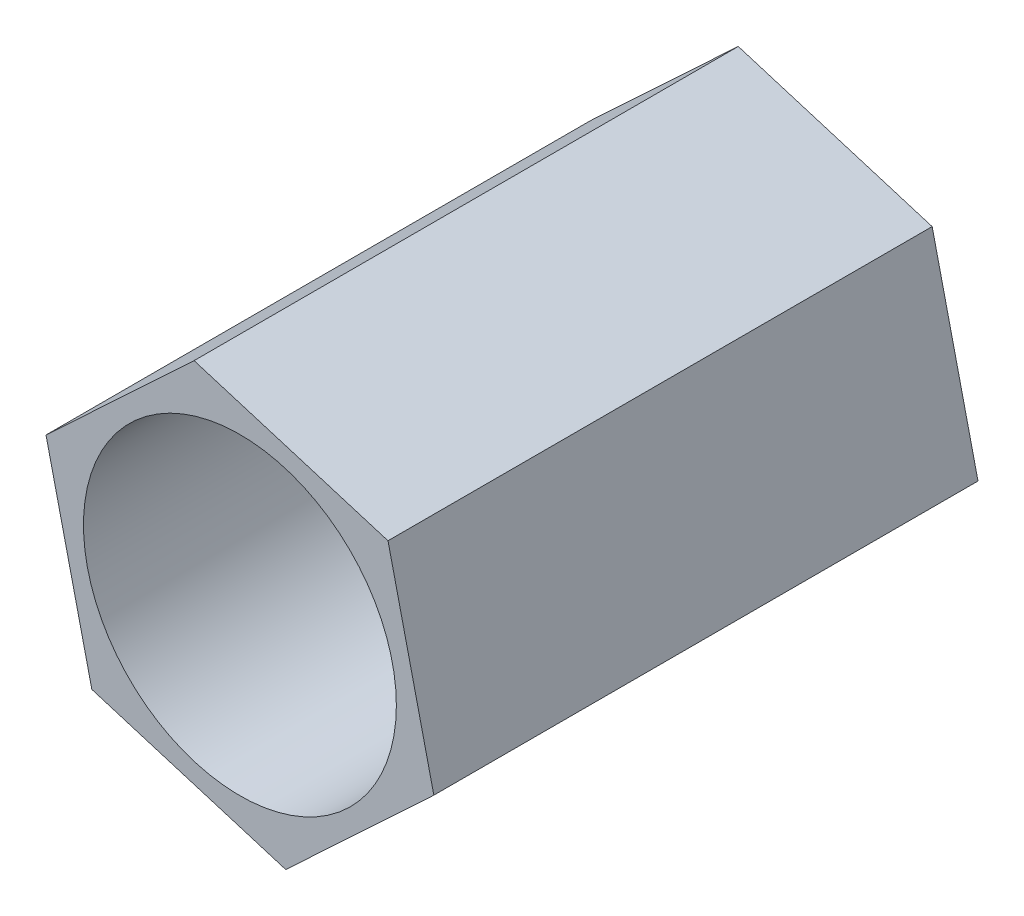
ISO-10303-21;
HEADER;
FILE_DESCRIPTION(('STEP AP214'),'2;1');
FILE_NAME('part.step','',(''),(''),'','','');
FILE_SCHEMA(('AUTOMOTIVE_DESIGN { 1 0 10303 214 1 1 1 1 }'));
ENDSEC;
DATA;
#1=APPLICATION_CONTEXT('core data for automotive mechanical design processes');
#2=APPLICATION_PROTOCOL_DEFINITION('international standard','automotive_design',2000,#1);
#3=PRODUCT_CONTEXT('',#1,'mechanical');
#4=PRODUCT('Part','Part','',(#3));
#5=PRODUCT_RELATED_PRODUCT_CATEGORY('part','',(#4));
#6=PRODUCT_DEFINITION_FORMATION('','',#4);
#7=PRODUCT_DEFINITION_CONTEXT('part definition',#1,'design');
#8=PRODUCT_DEFINITION('design','',#6,#7);
#9=PRODUCT_DEFINITION_SHAPE('','',#8);
#10=(LENGTH_UNIT() NAMED_UNIT(*) SI_UNIT(.MILLI.,.METRE.));
#11=(NAMED_UNIT(*) PLANE_ANGLE_UNIT() SI_UNIT($,.RADIAN.));
#12=(NAMED_UNIT(*) SI_UNIT($,.STERADIAN.) SOLID_ANGLE_UNIT());
#13=UNCERTAINTY_MEASURE_WITH_UNIT(LENGTH_MEASURE(1.E-05),#10,'distance_accuracy_value','');
#14=(GEOMETRIC_REPRESENTATION_CONTEXT(3) GLOBAL_UNCERTAINTY_ASSIGNED_CONTEXT((#13)) GLOBAL_UNIT_ASSIGNED_CONTEXT((#10,
#11,#12)) REPRESENTATION_CONTEXT('',''));
#15=CARTESIAN_POINT('',(0.,0.,0.));
#16=DIRECTION('',(0.,0.,1.));
#17=DIRECTION('',(1.,0.,0.));
#18=AXIS2_PLACEMENT_3D('',#15,#16,#17);
#19=CARTESIAN_POINT('',(0.,0.,10.));
#20=DIRECTION('',(0.,0.,1.));
#21=DIRECTION('',(1.,0.,0.));
#22=AXIS2_PLACEMENT_3D('',#19,#20,#21);
#23=PLANE('',#22);
#24=DIRECTION('',(0.226137706659468,-0.974095343191207,0.));
#25=VECTOR('',#24,1.);
#26=CARTESIAN_POINT('',(-3.56355911924937,1.08474485645919,10.));
#27=LINE('',#26,#25);
#28=CARTESIAN_POINT('',(-3.56355911924937,1.08474485645919,10.));
#29=VERTEX_POINT('',#28);
#30=CARTESIAN_POINT('',(-2.72119616194285,-2.54376029692806,10.));
#31=VERTEX_POINT('',#30);
#32=EDGE_CURVE('E146',#29,#31,#27,.T.);
#33=ORIENTED_EDGE('',*,*,#32,.T.);
#34=DIRECTION('',(0.956660166241441,-0.291206672874951,0.));
#35=VECTOR('',#34,1.);
#36=CARTESIAN_POINT('',(-2.72119616194285,-2.54376029692806,10.));
#37=LINE('',#36,#35);
#38=CARTESIAN_POINT('',(0.842362957306519,-3.62850515338725,10.));
#39=VERTEX_POINT('',#38);
#40=EDGE_CURVE('E94',#31,#39,#37,.T.);
#41=ORIENTED_EDGE('',*,*,#40,.T.);
#42=DIRECTION('',(0.730522459581972,0.682888670316257,0.));
#43=VECTOR('',#42,1.);
#44=CARTESIAN_POINT('',(0.842362957306519,-3.62850515338725,10.));
#45=LINE('',#44,#43);
#46=CARTESIAN_POINT('',(3.56355911924937,-1.08474485645919,10.));
#47=VERTEX_POINT('',#46);
#48=EDGE_CURVE('E107',#39,#47,#45,.T.);
#49=ORIENTED_EDGE('',*,*,#48,.T.);
#50=DIRECTION('',(-0.226137706659469,0.974095343191208,0.));
#51=VECTOR('',#50,1.);
#52=CARTESIAN_POINT('',(3.56355911924937,-1.08474485645919,10.));
#53=LINE('',#52,#51);
#54=CARTESIAN_POINT('',(2.72119616194285,2.54376029692806,10.));
#55=VERTEX_POINT('',#54);
#56=EDGE_CURVE('E101',#47,#55,#53,.T.);
#57=ORIENTED_EDGE('',*,*,#56,.T.);
#58=DIRECTION('',(-0.956660166241441,0.291206672874951,0.));
#59=VECTOR('',#58,1.);
#60=CARTESIAN_POINT('',(2.72119616194285,2.54376029692806,10.));
#61=LINE('',#60,#59);
#62=CARTESIAN_POINT('',(-0.84236295730652,3.62850515338725,10.));
#63=VERTEX_POINT('',#62);
#64=EDGE_CURVE('E105',#55,#63,#61,.T.);
#65=ORIENTED_EDGE('',*,*,#64,.T.);
#66=DIRECTION('',(-0.730522459581972,-0.682888670316257,0.));
#67=VECTOR('',#66,1.);
#68=CARTESIAN_POINT('',(-0.84236295730652,3.62850515338725,10.));
#69=LINE('',#68,#67);
#70=EDGE_CURVE('E57',#63,#29,#69,.T.);
#71=ORIENTED_EDGE('',*,*,#70,.T.);
#72=EDGE_LOOP('',(#33,#41,#49,#57,#65,#71));
#73=FACE_BOUND('',#72,.T.);
#74=CARTESIAN_POINT('',(0.,0.,10.));
#75=DIRECTION('',(0.,0.,1.));
#76=DIRECTION('',(1.,0.,0.));
#77=AXIS2_PLACEMENT_3D('',#74,#75,#76);
#78=CIRCLE('',#77,2.875);
#79=CARTESIAN_POINT('',(2.875,0.,10.));
#80=VERTEX_POINT('',#79);
#81=EDGE_CURVE('E134',#80,#80,#78,.T.);
#82=ORIENTED_EDGE('',*,*,#81,.F.);
#83=EDGE_LOOP('',(#82));
#84=FACE_BOUND('',#83,.T.);
#85=ADVANCED_FACE('F39',(#73,#84),#23,.T.);
#86=CARTESIAN_POINT('',(0.,0.,0.));
#87=DIRECTION('',(0.,0.,1.));
#88=DIRECTION('',(1.,0.,0.));
#89=AXIS2_PLACEMENT_3D('',#86,#87,#88);
#90=PLANE('',#89);
#91=DIRECTION('',(0.226137706659468,-0.974095343191207,0.));
#92=VECTOR('',#91,1.);
#93=CARTESIAN_POINT('',(-3.56355911924937,1.08474485645919,0.));
#94=LINE('',#93,#92);
#95=CARTESIAN_POINT('',(-3.56355911924937,1.08474485645919,0.));
#96=VERTEX_POINT('',#95);
#97=CARTESIAN_POINT('',(-2.72119616194285,-2.54376029692806,0.));
#98=VERTEX_POINT('',#97);
#99=EDGE_CURVE('E129',#96,#98,#94,.T.);
#100=ORIENTED_EDGE('',*,*,#99,.F.);
#101=DIRECTION('',(-0.730522459581972,-0.682888670316257,0.));
#102=VECTOR('',#101,1.);
#103=CARTESIAN_POINT('',(-0.84236295730652,3.62850515338725,0.));
#104=LINE('',#103,#102);
#105=CARTESIAN_POINT('',(-0.84236295730652,3.62850515338725,0.));
#106=VERTEX_POINT('',#105);
#107=EDGE_CURVE('E86',#106,#96,#104,.T.);
#108=ORIENTED_EDGE('',*,*,#107,.F.);
#109=DIRECTION('',(-0.956660166241441,0.291206672874951,0.));
#110=VECTOR('',#109,1.);
#111=CARTESIAN_POINT('',(2.72119616194285,2.54376029692806,0.));
#112=LINE('',#111,#110);
#113=CARTESIAN_POINT('',(2.72119616194285,2.54376029692806,0.));
#114=VERTEX_POINT('',#113);
#115=EDGE_CURVE('E80',#114,#106,#112,.T.);
#116=ORIENTED_EDGE('',*,*,#115,.F.);
#117=DIRECTION('',(-0.226137706659469,0.974095343191208,0.));
#118=VECTOR('',#117,1.);
#119=CARTESIAN_POINT('',(3.56355911924937,-1.08474485645919,0.));
#120=LINE('',#119,#118);
#121=CARTESIAN_POINT('',(3.56355911924937,-1.08474485645919,0.));
#122=VERTEX_POINT('',#121);
#123=EDGE_CURVE('E116',#122,#114,#120,.T.);
#124=ORIENTED_EDGE('',*,*,#123,.F.);
#125=DIRECTION('',(0.730522459581972,0.682888670316257,0.));
#126=VECTOR('',#125,1.);
#127=CARTESIAN_POINT('',(0.842362957306519,-3.62850515338725,0.));
#128=LINE('',#127,#126);
#129=CARTESIAN_POINT('',(0.842362957306519,-3.62850515338725,0.));
#130=VERTEX_POINT('',#129);
#131=EDGE_CURVE('E137',#130,#122,#128,.T.);
#132=ORIENTED_EDGE('',*,*,#131,.F.);
#133=DIRECTION('',(0.956660166241441,-0.291206672874951,0.));
#134=VECTOR('',#133,1.);
#135=CARTESIAN_POINT('',(-2.72119616194285,-2.54376029692806,0.));
#136=LINE('',#135,#134);
#137=EDGE_CURVE('E133',#98,#130,#136,.T.);
#138=ORIENTED_EDGE('',*,*,#137,.F.);
#139=EDGE_LOOP('',(#100,#108,#116,#124,#132,#138));
#140=FACE_BOUND('',#139,.T.);
#141=CARTESIAN_POINT('',(0.,0.,0.));
#142=DIRECTION('',(0.,0.,1.));
#143=DIRECTION('',(1.,0.,0.));
#144=AXIS2_PLACEMENT_3D('',#141,#142,#143);
#145=CIRCLE('',#144,2.875);
#146=CARTESIAN_POINT('',(2.875,0.,0.));
#147=VERTEX_POINT('',#146);
#148=EDGE_CURVE('E243',#147,#147,#145,.T.);
#149=ORIENTED_EDGE('',*,*,#148,.T.);
#150=EDGE_LOOP('',(#149));
#151=FACE_BOUND('',#150,.T.);
#152=ADVANCED_FACE('F159',(#140,#151),#90,.F.);
#153=CARTESIAN_POINT('',(-3.56355911924937,1.08474485645919,10.));
#154=DIRECTION('',(0.974095343191208,0.226137706659468,0.));
#155=DIRECTION('',(-0.226137706659468,0.974095343191208,0.));
#156=AXIS2_PLACEMENT_3D('',#153,#154,#155);
#157=PLANE('',#156);
#158=ORIENTED_EDGE('',*,*,#99,.T.);
#159=DIRECTION('',(0.,0.,-1.));
#160=VECTOR('',#159,1.);
#161=CARTESIAN_POINT('',(-2.72119616194285,-2.54376029692806,10.));
#162=LINE('',#161,#160);
#163=EDGE_CURVE('E11',#31,#98,#162,.T.);
#164=ORIENTED_EDGE('',*,*,#163,.F.);
#165=ORIENTED_EDGE('',*,*,#32,.F.);
#166=DIRECTION('',(0.,0.,-1.));
#167=VECTOR('',#166,1.);
#168=CARTESIAN_POINT('',(-3.56355911924937,1.08474485645919,10.));
#169=LINE('',#168,#167);
#170=EDGE_CURVE('E125',#29,#96,#169,.T.);
#171=ORIENTED_EDGE('',*,*,#170,.T.);
#172=EDGE_LOOP('',(#158,#164,#165,#171));
#173=FACE_BOUND('',#172,.T.);
#174=ADVANCED_FACE('F41',(#173),#157,.F.);
#175=CARTESIAN_POINT('',(-2.72119616194285,-2.54376029692806,10.));
#176=DIRECTION('',(0.291206672874951,0.956660166241441,0.));
#177=DIRECTION('',(-0.956660166241441,0.291206672874951,0.));
#178=AXIS2_PLACEMENT_3D('',#175,#176,#177);
#179=PLANE('',#178);
#180=ORIENTED_EDGE('',*,*,#137,.T.);
#181=DIRECTION('',(0.,0.,-1.));
#182=VECTOR('',#181,1.);
#183=CARTESIAN_POINT('',(0.842362957306519,-3.62850515338725,10.));
#184=LINE('',#183,#182);
#185=EDGE_CURVE('E49',#39,#130,#184,.T.);
#186=ORIENTED_EDGE('',*,*,#185,.F.);
#187=ORIENTED_EDGE('',*,*,#40,.F.);
#188=ORIENTED_EDGE('',*,*,#163,.T.);
#189=EDGE_LOOP('',(#180,#186,#187,#188));
#190=FACE_BOUND('',#189,.T.);
#191=ADVANCED_FACE('F184',(#190),#179,.F.);
#192=CARTESIAN_POINT('',(0.842362957306519,-3.62850515338725,10.));
#193=DIRECTION('',(-0.682888670316257,0.730522459581972,0.));
#194=DIRECTION('',(-0.730522459581972,-0.682888670316257,0.));
#195=AXIS2_PLACEMENT_3D('',#192,#193,#194);
#196=PLANE('',#195);
#197=ORIENTED_EDGE('',*,*,#131,.T.);
#198=DIRECTION('',(0.,0.,-1.));
#199=VECTOR('',#198,1.);
#200=CARTESIAN_POINT('',(3.56355911924937,-1.08474485645919,10.));
#201=LINE('',#200,#199);
#202=EDGE_CURVE('E118',#47,#122,#201,.T.);
#203=ORIENTED_EDGE('',*,*,#202,.F.);
#204=ORIENTED_EDGE('',*,*,#48,.F.);
#205=ORIENTED_EDGE('',*,*,#185,.T.);
#206=EDGE_LOOP('',(#197,#203,#204,#205));
#207=FACE_BOUND('',#206,.T.);
#208=ADVANCED_FACE('F156',(#207),#196,.F.);
#209=CARTESIAN_POINT('',(3.56355911924937,-1.08474485645919,10.));
#210=DIRECTION('',(-0.974095343191207,-0.226137706659469,0.));
#211=DIRECTION('',(0.226137706659469,-0.974095343191208,0.));
#212=AXIS2_PLACEMENT_3D('',#209,#210,#211);
#213=PLANE('',#212);
#214=ORIENTED_EDGE('',*,*,#123,.T.);
#215=DIRECTION('',(0.,0.,-1.));
#216=VECTOR('',#215,1.);
#217=CARTESIAN_POINT('',(2.72119616194285,2.54376029692806,10.));
#218=LINE('',#217,#216);
#219=EDGE_CURVE('E113',#55,#114,#218,.T.);
#220=ORIENTED_EDGE('',*,*,#219,.F.);
#221=ORIENTED_EDGE('',*,*,#56,.F.);
#222=ORIENTED_EDGE('',*,*,#202,.T.);
#223=EDGE_LOOP('',(#214,#220,#221,#222));
#224=FACE_BOUND('',#223,.T.);
#225=ADVANCED_FACE('F114',(#224),#213,.F.);
#226=CARTESIAN_POINT('',(2.72119616194285,2.54376029692806,10.));
#227=DIRECTION('',(-0.291206672874951,-0.956660166241441,0.));
#228=DIRECTION('',(0.956660166241441,-0.291206672874951,0.));
#229=AXIS2_PLACEMENT_3D('',#226,#227,#228);
#230=PLANE('',#229);
#231=ORIENTED_EDGE('',*,*,#115,.T.);
#232=DIRECTION('',(0.,0.,-1.));
#233=VECTOR('',#232,1.);
#234=CARTESIAN_POINT('',(-0.84236295730652,3.62850515338725,10.));
#235=LINE('',#234,#233);
#236=EDGE_CURVE('E119',#63,#106,#235,.T.);
#237=ORIENTED_EDGE('',*,*,#236,.F.);
#238=ORIENTED_EDGE('',*,*,#64,.F.);
#239=ORIENTED_EDGE('',*,*,#219,.T.);
#240=EDGE_LOOP('',(#231,#237,#238,#239));
#241=FACE_BOUND('',#240,.T.);
#242=ADVANCED_FACE('F121',(#241),#230,.F.);
#243=CARTESIAN_POINT('',(-0.84236295730652,3.62850515338725,10.));
#244=DIRECTION('',(0.682888670316257,-0.730522459581972,0.));
#245=DIRECTION('',(0.730522459581972,0.682888670316257,0.));
#246=AXIS2_PLACEMENT_3D('',#243,#244,#245);
#247=PLANE('',#246);
#248=ORIENTED_EDGE('',*,*,#107,.T.);
#249=ORIENTED_EDGE('',*,*,#170,.F.);
#250=ORIENTED_EDGE('',*,*,#70,.F.);
#251=ORIENTED_EDGE('',*,*,#236,.T.);
#252=EDGE_LOOP('',(#248,#249,#250,#251));
#253=FACE_BOUND('',#252,.T.);
#254=ADVANCED_FACE('F164',(#253),#247,.F.);
#255=CARTESIAN_POINT('',(0.,0.,10.));
#256=DIRECTION('',(0.,0.,-1.));
#257=DIRECTION('',(-1.,0.,0.));
#258=AXIS2_PLACEMENT_3D('',#255,#256,#257);
#259=CYLINDRICAL_SURFACE('',#258,2.875);
#260=ORIENTED_EDGE('',*,*,#81,.T.);
#261=EDGE_LOOP('',(#260));
#262=FACE_BOUND('',#261,.T.);
#263=ORIENTED_EDGE('',*,*,#148,.F.);
#264=EDGE_LOOP('',(#263));
#265=FACE_BOUND('',#264,.T.);
#266=ADVANCED_FACE('F166',(#262,#265),#259,.F.);
#267=CLOSED_SHELL('',(#85,#152,#174,#191,#208,#225,#242,#254,#266));
#268=MANIFOLD_SOLID_BREP('B2',#267);
#269=ADVANCED_BREP_SHAPE_REPRESENTATION('',(#18,#268),#14);
#270=SHAPE_DEFINITION_REPRESENTATION(#9,#269);
ENDSEC;
END-ISO-10303-21;
